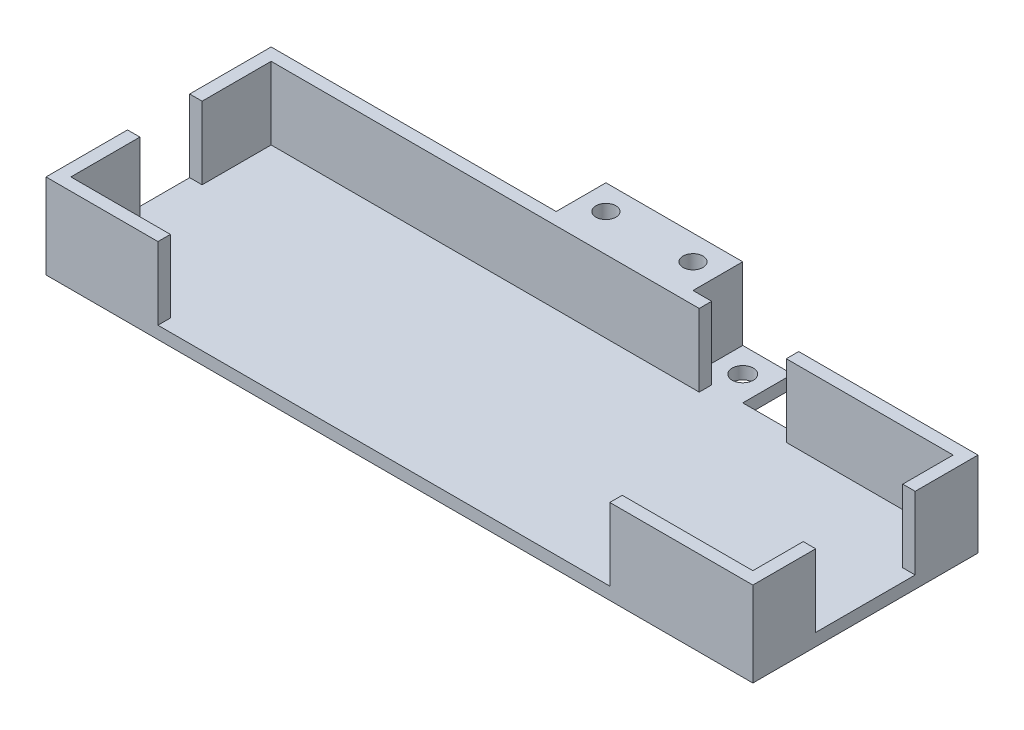
ISO-10303-21;
HEADER;
FILE_DESCRIPTION(('STEP AP214'),'2;1');
FILE_NAME('part.step','',(''),(''),'','','');
FILE_SCHEMA(('AUTOMOTIVE_DESIGN { 1 0 10303 214 1 1 1 1 }'));
ENDSEC;
DATA;
#1=APPLICATION_CONTEXT('core data for automotive mechanical design processes');
#2=APPLICATION_PROTOCOL_DEFINITION('international standard','automotive_design',2000,#1);
#3=PRODUCT_CONTEXT('',#1,'mechanical');
#4=PRODUCT('Part','Part','',(#3));
#5=PRODUCT_RELATED_PRODUCT_CATEGORY('part','',(#4));
#6=PRODUCT_DEFINITION_FORMATION('','',#4);
#7=PRODUCT_DEFINITION_CONTEXT('part definition',#1,'design');
#8=PRODUCT_DEFINITION('design','',#6,#7);
#9=PRODUCT_DEFINITION_SHAPE('','',#8);
#10=(LENGTH_UNIT() NAMED_UNIT(*) SI_UNIT(.MILLI.,.METRE.));
#11=(NAMED_UNIT(*) PLANE_ANGLE_UNIT() SI_UNIT($,.RADIAN.));
#12=(NAMED_UNIT(*) SI_UNIT($,.STERADIAN.) SOLID_ANGLE_UNIT());
#13=UNCERTAINTY_MEASURE_WITH_UNIT(LENGTH_MEASURE(1.E-05),#10,'distance_accuracy_value','');
#14=(GEOMETRIC_REPRESENTATION_CONTEXT(3) GLOBAL_UNCERTAINTY_ASSIGNED_CONTEXT((#13)) GLOBAL_UNIT_ASSIGNED_CONTEXT((#10,
#11,#12)) REPRESENTATION_CONTEXT('',''));
#15=CARTESIAN_POINT('',(0.,0.,0.));
#16=DIRECTION('',(0.,0.,1.));
#17=DIRECTION('',(1.,0.,0.));
#18=AXIS2_PLACEMENT_3D('',#15,#16,#17);
#19=CARTESIAN_POINT('',(0.,2.,-33.2));
#20=DIRECTION('',(0.,0.,-1.));
#21=DIRECTION('',(-1.,0.,0.));
#22=AXIS2_PLACEMENT_3D('',#19,#20,#21);
#23=PLANE('',#22);
#24=DIRECTION('',(0.,1.,0.));
#25=VECTOR('',#24,1.);
#26=CARTESIAN_POINT('',(67.825,-12.1421356237309,-33.2));
#27=LINE('',#26,#25);
#28=CARTESIAN_POINT('',(67.825,2.,-33.2));
#29=VERTEX_POINT('',#28);
#30=CARTESIAN_POINT('',(67.825,13.65,-33.2));
#31=VERTEX_POINT('',#30);
#32=EDGE_CURVE('E249',#29,#31,#27,.T.);
#33=ORIENTED_EDGE('',*,*,#32,.F.);
#34=DIRECTION('',(-1.,0.,0.));
#35=VECTOR('',#34,1.);
#36=CARTESIAN_POINT('',(34.825,2.,-33.2));
#37=LINE('',#36,#35);
#38=CARTESIAN_POINT('',(64.825,2.,-33.2));
#39=VERTEX_POINT('',#38);
#40=EDGE_CURVE('E454',#29,#39,#37,.T.);
#41=ORIENTED_EDGE('',*,*,#40,.T.);
#42=DIRECTION('',(0.,-1.,0.));
#43=VECTOR('',#42,1.);
#44=CARTESIAN_POINT('',(64.825,13.65,-33.2));
#45=LINE('',#44,#43);
#46=CARTESIAN_POINT('',(64.825,13.65,-33.2));
#47=VERTEX_POINT('',#46);
#48=EDGE_CURVE('E273',#47,#39,#45,.T.);
#49=ORIENTED_EDGE('',*,*,#48,.F.);
#50=DIRECTION('',(-1.,0.,0.));
#51=VECTOR('',#50,1.);
#52=CARTESIAN_POINT('',(110.65,13.65,-33.2));
#53=LINE('',#52,#51);
#54=EDGE_CURVE('E266',#31,#47,#53,.T.);
#55=ORIENTED_EDGE('',*,*,#54,.F.);
#56=EDGE_LOOP('',(#33,#41,#49,#55));
#57=FACE_BOUND('',#56,.T.);
#58=ADVANCED_FACE('F39',(#57),#23,.T.);
#59=CARTESIAN_POINT('',(108.65,13.65,-31.2));
#60=DIRECTION('',(0.,0.,-1.));
#61=DIRECTION('',(-1.,0.,0.));
#62=AXIS2_PLACEMENT_3D('',#59,#60,#61);
#63=PLANE('',#62);
#64=DIRECTION('',(1.,0.,0.));
#65=VECTOR('',#64,1.);
#66=CARTESIAN_POINT('',(108.65,13.65,-31.2));
#67=LINE('',#66,#65);
#68=CARTESIAN_POINT('',(81.825,13.65,-31.2));
#69=VERTEX_POINT('',#68);
#70=CARTESIAN_POINT('',(108.65,13.65,-31.2));
#71=VERTEX_POINT('',#70);
#72=EDGE_CURVE('E290',#69,#71,#67,.T.);
#73=ORIENTED_EDGE('',*,*,#72,.F.);
#74=DIRECTION('',(0.,1.,0.));
#75=VECTOR('',#74,1.);
#76=CARTESIAN_POINT('',(81.825,-12.1421356237309,-31.2));
#77=LINE('',#76,#75);
#78=CARTESIAN_POINT('',(81.825,2.,-31.2));
#79=VERTEX_POINT('',#78);
#80=EDGE_CURVE('E559',#79,#69,#77,.T.);
#81=ORIENTED_EDGE('',*,*,#80,.F.);
#82=DIRECTION('',(1.,0.,0.));
#83=VECTOR('',#82,1.);
#84=CARTESIAN_POINT('',(108.65,2.,-31.2));
#85=LINE('',#84,#83);
#86=CARTESIAN_POINT('',(108.65,2.,-31.2));
#87=VERTEX_POINT('',#86);
#88=EDGE_CURVE('E543',#79,#87,#85,.T.);
#89=ORIENTED_EDGE('',*,*,#88,.T.);
#90=DIRECTION('',(0.,-1.,0.));
#91=VECTOR('',#90,1.);
#92=CARTESIAN_POINT('',(108.65,13.65,-31.2));
#93=LINE('',#92,#91);
#94=EDGE_CURVE('E531',#71,#87,#93,.T.);
#95=ORIENTED_EDGE('',*,*,#94,.F.);
#96=EDGE_LOOP('',(#73,#81,#89,#95));
#97=FACE_BOUND('',#96,.T.);
#98=ADVANCED_FACE('F395',(#97),#63,.F.);
#99=CARTESIAN_POINT('',(0.,13.65,0.));
#100=DIRECTION('',(0.,-1.,0.));
#101=DIRECTION('',(0.,0.,-1.));
#102=AXIS2_PLACEMENT_3D('',#99,#100,#101);
#103=PLANE('',#102);
#104=CARTESIAN_POINT('',(110.65,13.65,-33.2));
#105=VERTEX_POINT('',#104);
#106=CARTESIAN_POINT('',(81.825,13.65,-33.2));
#107=VERTEX_POINT('',#106);
#108=EDGE_CURVE('E274',#105,#107,#53,.T.);
#109=ORIENTED_EDGE('',*,*,#108,.T.);
#110=DIRECTION('',(0.,0.,-1.));
#111=VECTOR('',#110,1.);
#112=CARTESIAN_POINT('',(81.825,13.65,-33.2));
#113=LINE('',#112,#111);
#114=EDGE_CURVE('E260',#69,#107,#113,.T.);
#115=ORIENTED_EDGE('',*,*,#114,.F.);
#116=ORIENTED_EDGE('',*,*,#72,.T.);
#117=DIRECTION('',(0.,0.,1.));
#118=VECTOR('',#117,1.);
#119=CARTESIAN_POINT('',(108.65,13.65,-23.1));
#120=LINE('',#119,#118);
#121=CARTESIAN_POINT('',(108.65,13.65,-23.1));
#122=VERTEX_POINT('',#121);
#123=EDGE_CURVE('E288',#71,#122,#120,.T.);
#124=ORIENTED_EDGE('',*,*,#123,.T.);
#125=DIRECTION('',(1.,0.,0.));
#126=VECTOR('',#125,1.);
#127=CARTESIAN_POINT('',(108.65,13.65,-23.1));
#128=LINE('',#127,#126);
#129=CARTESIAN_POINT('',(110.65,13.65,-23.1));
#130=VERTEX_POINT('',#129);
#131=EDGE_CURVE('E286',#122,#130,#128,.T.);
#132=ORIENTED_EDGE('',*,*,#131,.T.);
#133=DIRECTION('',(0.,0.,-1.));
#134=VECTOR('',#133,1.);
#135=CARTESIAN_POINT('',(110.65,13.65,-23.1));
#136=LINE('',#135,#134);
#137=EDGE_CURVE('E278',#130,#105,#136,.T.);
#138=ORIENTED_EDGE('',*,*,#137,.T.);
#139=EDGE_LOOP('',(#109,#115,#116,#124,#132,#138));
#140=FACE_BOUND('',#139,.T.);
#141=ADVANCED_FACE('F402',(#140),#103,.F.);
#142=CARTESIAN_POINT('',(42.825,13.65,-33.2));
#143=VERTEX_POINT('',#142);
#144=CARTESIAN_POINT('',(-3.,13.65,-33.2));
#145=VERTEX_POINT('',#144);
#146=EDGE_CURVE('E275',#143,#145,#53,.T.);
#147=ORIENTED_EDGE('',*,*,#146,.F.);
#148=DIRECTION('',(0.,-1.,0.));
#149=VECTOR('',#148,1.);
#150=CARTESIAN_POINT('',(42.825,13.65,-33.2));
#151=LINE('',#150,#149);
#152=CARTESIAN_POINT('',(42.825,2.,-33.2));
#153=VERTEX_POINT('',#152);
#154=EDGE_CURVE('E422',#143,#153,#151,.T.);
#155=ORIENTED_EDGE('',*,*,#154,.T.);
#156=CARTESIAN_POINT('',(34.825,2.,-33.2));
#157=VERTEX_POINT('',#156);
#158=EDGE_CURVE('E457',#153,#157,#37,.T.);
#159=ORIENTED_EDGE('',*,*,#158,.T.);
#160=DIRECTION('',(0.,-1.,0.));
#161=VECTOR('',#160,1.);
#162=CARTESIAN_POINT('',(34.825,2.,-33.2));
#163=LINE('',#162,#161);
#164=CARTESIAN_POINT('',(34.825,0.,-33.2));
#165=VERTEX_POINT('',#164);
#166=EDGE_CURVE('E467',#157,#165,#163,.T.);
#167=ORIENTED_EDGE('',*,*,#166,.T.);
#168=DIRECTION('',(1.,0.,0.));
#169=VECTOR('',#168,1.);
#170=CARTESIAN_POINT('',(0.,0.,-33.2));
#171=LINE('',#170,#169);
#172=CARTESIAN_POINT('',(-3.,0.,-33.2));
#173=VERTEX_POINT('',#172);
#174=EDGE_CURVE('E346',#173,#165,#171,.T.);
#175=ORIENTED_EDGE('',*,*,#174,.F.);
#176=DIRECTION('',(0.,-1.,0.));
#177=VECTOR('',#176,1.);
#178=CARTESIAN_POINT('',(-3.,2.,-33.2));
#179=LINE('',#178,#177);
#180=EDGE_CURVE('E350',#145,#173,#179,.T.);
#181=ORIENTED_EDGE('',*,*,#180,.F.);
#182=EDGE_LOOP('',(#147,#155,#159,#167,#175,#181));
#183=FACE_BOUND('',#182,.T.);
#184=ADVANCED_FACE('F398',(#183),#23,.T.);
#185=DIRECTION('',(0.,1.,0.));
#186=VECTOR('',#185,1.);
#187=CARTESIAN_POINT('',(81.825,-12.1421356237309,-33.2));
#188=LINE('',#187,#186);
#189=CARTESIAN_POINT('',(81.825,2.,-33.2));
#190=VERTEX_POINT('',#189);
#191=EDGE_CURVE('E561',#190,#107,#188,.T.);
#192=ORIENTED_EDGE('',*,*,#191,.T.);
#193=ORIENTED_EDGE('',*,*,#108,.F.);
#194=DIRECTION('',(0.,-1.,0.));
#195=VECTOR('',#194,1.);
#196=CARTESIAN_POINT('',(110.65,2.,-33.2));
#197=LINE('',#196,#195);
#198=CARTESIAN_POINT('',(110.65,0.,-33.2));
#199=VERTEX_POINT('',#198);
#200=EDGE_CURVE('E362',#105,#199,#197,.T.);
#201=ORIENTED_EDGE('',*,*,#200,.T.);
#202=CARTESIAN_POINT('',(72.825,0.,-33.2));
#203=VERTEX_POINT('',#202);
#204=EDGE_CURVE('E358',#203,#199,#171,.T.);
#205=ORIENTED_EDGE('',*,*,#204,.F.);
#206=DIRECTION('',(0.,-1.,0.));
#207=VECTOR('',#206,1.);
#208=CARTESIAN_POINT('',(72.825,2.,-33.2));
#209=LINE('',#208,#207);
#210=CARTESIAN_POINT('',(72.825,2.,-33.2));
#211=VERTEX_POINT('',#210);
#212=EDGE_CURVE('E475',#211,#203,#209,.T.);
#213=ORIENTED_EDGE('',*,*,#212,.F.);
#214=DIRECTION('',(1.,0.,0.));
#215=VECTOR('',#214,1.);
#216=CARTESIAN_POINT('',(67.825,2.,-33.2));
#217=LINE('',#216,#215);
#218=EDGE_CURVE('E567',#211,#190,#217,.T.);
#219=ORIENTED_EDGE('',*,*,#218,.T.);
#220=EDGE_LOOP('',(#192,#193,#201,#205,#213,#219));
#221=FACE_BOUND('',#220,.T.);
#222=ADVANCED_FACE('F397',(#221),#23,.T.);
#223=CARTESIAN_POINT('',(0.,2.,0.));
#224=DIRECTION('',(0.,1.,0.));
#225=DIRECTION('',(0.,0.,1.));
#226=AXIS2_PLACEMENT_3D('',#223,#224,#225);
#227=PLANE('',#226);
#228=CARTESIAN_POINT('',(38.825,2.,-37.2));
#229=DIRECTION('',(0.,-1.,0.));
#230=DIRECTION('',(0.,0.,1.));
#231=AXIS2_PLACEMENT_3D('',#228,#229,#230);
#232=CIRCLE('',#231,1.7);
#233=CARTESIAN_POINT('',(38.825,2.,-35.5));
#234=VERTEX_POINT('',#233);
#235=EDGE_CURVE('E441',#234,#234,#232,.T.);
#236=ORIENTED_EDGE('',*,*,#235,.T.);
#237=EDGE_LOOP('',(#236));
#238=FACE_BOUND('',#237,.T.);
#239=ORIENTED_EDGE('',*,*,#158,.F.);
#240=DIRECTION('',(0.,0.,1.));
#241=VECTOR('',#240,1.);
#242=CARTESIAN_POINT('',(42.825,2.,-33.2));
#243=LINE('',#242,#241);
#244=CARTESIAN_POINT('',(42.825,2.,-41.2));
#245=VERTEX_POINT('',#244);
#246=EDGE_CURVE('E437',#245,#153,#243,.T.);
#247=ORIENTED_EDGE('',*,*,#246,.F.);
#248=DIRECTION('',(1.,0.,0.));
#249=VECTOR('',#248,1.);
#250=CARTESIAN_POINT('',(34.825,2.,-41.2));
#251=LINE('',#250,#249);
#252=CARTESIAN_POINT('',(34.825,2.,-41.2));
#253=VERTEX_POINT('',#252);
#254=EDGE_CURVE('E461',#253,#245,#251,.T.);
#255=ORIENTED_EDGE('',*,*,#254,.F.);
#256=DIRECTION('',(0.,0.,-1.));
#257=VECTOR('',#256,1.);
#258=CARTESIAN_POINT('',(34.825,2.,-33.2));
#259=LINE('',#258,#257);
#260=EDGE_CURVE('E456',#157,#253,#259,.T.);
#261=ORIENTED_EDGE('',*,*,#260,.F.);
#262=EDGE_LOOP('',(#239,#247,#255,#261));
#263=FACE_BOUND('',#262,.T.);
#264=ADVANCED_FACE('F385',(#238,#263),#227,.T.);
#265=DIRECTION('',(1.,0.,0.));
#266=VECTOR('',#265,1.);
#267=CARTESIAN_POINT('',(0.,2.,3.));
#268=LINE('',#267,#266);
#269=CARTESIAN_POINT('',(15.,2.,3.));
#270=VERTEX_POINT('',#269);
#271=CARTESIAN_POINT('',(87.65,2.,3.));
#272=VERTEX_POINT('',#271);
#273=EDGE_CURVE('E345',#270,#272,#268,.T.);
#274=ORIENTED_EDGE('',*,*,#273,.T.);
#275=DIRECTION('',(0.,0.,1.));
#276=VECTOR('',#275,1.);
#277=CARTESIAN_POINT('',(87.65,2.,0.999999999999995));
#278=LINE('',#277,#276);
#279=CARTESIAN_POINT('',(87.65,2.,0.999999999999995));
#280=VERTEX_POINT('',#279);
#281=EDGE_CURVE('E505',#280,#272,#278,.T.);
#282=ORIENTED_EDGE('',*,*,#281,.F.);
#283=DIRECTION('',(-1.,0.,0.));
#284=VECTOR('',#283,1.);
#285=CARTESIAN_POINT('',(87.65,2.,0.999999999999995));
#286=LINE('',#285,#284);
#287=CARTESIAN_POINT('',(108.65,2.,1.));
#288=VERTEX_POINT('',#287);
#289=EDGE_CURVE('E508',#288,#280,#286,.T.);
#290=ORIENTED_EDGE('',*,*,#289,.F.);
#291=DIRECTION('',(0.,0.,1.));
#292=VECTOR('',#291,1.);
#293=CARTESIAN_POINT('',(108.65,2.,1.));
#294=LINE('',#293,#292);
#295=CARTESIAN_POINT('',(108.65,2.,-7.10000000000001));
#296=VERTEX_POINT('',#295);
#297=EDGE_CURVE('E498',#296,#288,#294,.T.);
#298=ORIENTED_EDGE('',*,*,#297,.F.);
#299=DIRECTION('',(-1.,0.,0.));
#300=VECTOR('',#299,1.);
#301=CARTESIAN_POINT('',(108.65,2.,-7.10000000000001));
#302=LINE('',#301,#300);
#303=CARTESIAN_POINT('',(110.65,2.,-7.1));
#304=VERTEX_POINT('',#303);
#305=EDGE_CURVE('E501',#304,#296,#302,.T.);
#306=ORIENTED_EDGE('',*,*,#305,.F.);
#307=DIRECTION('',(0.,0.,-1.));
#308=VECTOR('',#307,1.);
#309=CARTESIAN_POINT('',(110.65,2.,0.));
#310=LINE('',#309,#308);
#311=CARTESIAN_POINT('',(110.65,2.,-23.1));
#312=VERTEX_POINT('',#311);
#313=EDGE_CURVE('E348',#304,#312,#310,.T.);
#314=ORIENTED_EDGE('',*,*,#313,.T.);
#315=DIRECTION('',(1.,0.,0.));
#316=VECTOR('',#315,1.);
#317=CARTESIAN_POINT('',(108.65,2.,-23.1));
#318=LINE('',#317,#316);
#319=CARTESIAN_POINT('',(108.65,2.,-23.1));
#320=VERTEX_POINT('',#319);
#321=EDGE_CURVE('E299',#320,#312,#318,.T.);
#322=ORIENTED_EDGE('',*,*,#321,.F.);
#323=DIRECTION('',(0.,0.,1.));
#324=VECTOR('',#323,1.);
#325=CARTESIAN_POINT('',(108.65,2.,-23.1));
#326=LINE('',#325,#324);
#327=EDGE_CURVE('E541',#87,#320,#326,.T.);
#328=ORIENTED_EDGE('',*,*,#327,.F.);
#329=ORIENTED_EDGE('',*,*,#88,.F.);
#330=DIRECTION('',(0.,0.,1.));
#331=VECTOR('',#330,1.);
#332=CARTESIAN_POINT('',(81.825,2.,-33.2));
#333=LINE('',#332,#331);
#334=EDGE_CURVE('E650',#190,#79,#333,.T.);
#335=ORIENTED_EDGE('',*,*,#334,.F.);
#336=ORIENTED_EDGE('',*,*,#218,.F.);
#337=DIRECTION('',(0.,0.,1.));
#338=VECTOR('',#337,1.);
#339=CARTESIAN_POINT('',(72.825,2.,-33.2));
#340=LINE('',#339,#338);
#341=CARTESIAN_POINT('',(72.825,2.,-41.2));
#342=VERTEX_POINT('',#341);
#343=EDGE_CURVE('E464',#342,#211,#340,.T.);
#344=ORIENTED_EDGE('',*,*,#343,.F.);
#345=CARTESIAN_POINT('',(64.825,2.,-41.2));
#346=VERTEX_POINT('',#345);
#347=EDGE_CURVE('E460',#346,#342,#251,.T.);
#348=ORIENTED_EDGE('',*,*,#347,.F.);
#349=DIRECTION('',(0.,0.,-1.));
#350=VECTOR('',#349,1.);
#351=CARTESIAN_POINT('',(64.825,2.,-33.2));
#352=LINE('',#351,#350);
#353=EDGE_CURVE('E433',#39,#346,#352,.T.);
#354=ORIENTED_EDGE('',*,*,#353,.F.);
#355=ORIENTED_EDGE('',*,*,#40,.F.);
#356=DIRECTION('',(0.,0.,-1.));
#357=VECTOR('',#356,1.);
#358=CARTESIAN_POINT('',(67.825,2.,-33.2));
#359=LINE('',#358,#357);
#360=CARTESIAN_POINT('',(67.825,2.,-31.2));
#361=VERTEX_POINT('',#360);
#362=EDGE_CURVE('E255',#361,#29,#359,.T.);
#363=ORIENTED_EDGE('',*,*,#362,.F.);
#364=CARTESIAN_POINT('',(-1.,2.,-31.2));
#365=VERTEX_POINT('',#364);
#366=EDGE_CURVE('E544',#365,#361,#85,.T.);
#367=ORIENTED_EDGE('',*,*,#366,.F.);
#368=DIRECTION('',(0.,0.,-1.));
#369=VECTOR('',#368,1.);
#370=CARTESIAN_POINT('',(-1.,2.,-31.2));
#371=LINE('',#370,#369);
#372=CARTESIAN_POINT('',(-1.,2.,-20.1));
#373=VERTEX_POINT('',#372);
#374=EDGE_CURVE('E546',#373,#365,#371,.T.);
#375=ORIENTED_EDGE('',*,*,#374,.F.);
#376=DIRECTION('',(1.,0.,0.));
#377=VECTOR('',#376,1.);
#378=CARTESIAN_POINT('',(-1.,2.,-20.1));
#379=LINE('',#378,#377);
#380=CARTESIAN_POINT('',(-3.,2.,-20.1));
#381=VERTEX_POINT('',#380);
#382=EDGE_CURVE('E282',#381,#373,#379,.T.);
#383=ORIENTED_EDGE('',*,*,#382,.F.);
#384=DIRECTION('',(0.,0.,-1.));
#385=VECTOR('',#384,1.);
#386=CARTESIAN_POINT('',(-3.,2.,0.));
#387=LINE('',#386,#385);
#388=CARTESIAN_POINT('',(-3.,2.,-10.1));
#389=VERTEX_POINT('',#388);
#390=EDGE_CURVE('E342',#389,#381,#387,.T.);
#391=ORIENTED_EDGE('',*,*,#390,.F.);
#392=DIRECTION('',(-1.,0.,0.));
#393=VECTOR('',#392,1.);
#394=CARTESIAN_POINT('',(-0.999999999999999,2.,-10.1));
#395=LINE('',#394,#393);
#396=CARTESIAN_POINT('',(-0.999999999999999,2.,-10.1));
#397=VERTEX_POINT('',#396);
#398=EDGE_CURVE('E322',#397,#389,#395,.T.);
#399=ORIENTED_EDGE('',*,*,#398,.F.);
#400=DIRECTION('',(0.,0.,-1.));
#401=VECTOR('',#400,1.);
#402=CARTESIAN_POINT('',(-0.999999999999999,2.,-10.1));
#403=LINE('',#402,#401);
#404=CARTESIAN_POINT('',(-1.,2.,1.));
#405=VERTEX_POINT('',#404);
#406=EDGE_CURVE('E319',#405,#397,#403,.T.);
#407=ORIENTED_EDGE('',*,*,#406,.F.);
#408=DIRECTION('',(-1.,0.,0.));
#409=VECTOR('',#408,1.);
#410=CARTESIAN_POINT('',(-1.,2.,1.));
#411=LINE('',#410,#409);
#412=CARTESIAN_POINT('',(15.,2.,0.999999999999999));
#413=VERTEX_POINT('',#412);
#414=EDGE_CURVE('E316',#413,#405,#411,.T.);
#415=ORIENTED_EDGE('',*,*,#414,.F.);
#416=DIRECTION('',(0.,0.,-1.));
#417=VECTOR('',#416,1.);
#418=CARTESIAN_POINT('',(15.,2.,0.999999999999999));
#419=LINE('',#418,#417);
#420=EDGE_CURVE('E304',#270,#413,#419,.T.);
#421=ORIENTED_EDGE('',*,*,#420,.F.);
#422=EDGE_LOOP('',(#274,#282,#290,#298,#306,#314,#322,#328,#329,#335,#336,#344,#348,#354,#355,
#363,#367,#375,#383,#391,#399,#407,#415,#421));
#423=FACE_BOUND('',#422,.T.);
#424=CARTESIAN_POINT('',(68.825,2.,-37.2));
#425=DIRECTION('',(0.,-1.,0.));
#426=DIRECTION('',(0.,0.,1.));
#427=AXIS2_PLACEMENT_3D('',#424,#425,#426);
#428=CIRCLE('',#427,1.7);
#429=CARTESIAN_POINT('',(68.825,2.,-35.5));
#430=VERTEX_POINT('',#429);
#431=EDGE_CURVE('E449',#430,#430,#428,.T.);
#432=ORIENTED_EDGE('',*,*,#431,.T.);
#433=EDGE_LOOP('',(#432));
#434=FACE_BOUND('',#433,.T.);
#435=ADVANCED_FACE('F378',(#423,#434),#227,.T.);
#436=CARTESIAN_POINT('',(-3.,2.,0.));
#437=DIRECTION('',(-1.,0.,0.));
#438=DIRECTION('',(0.,0.,1.));
#439=AXIS2_PLACEMENT_3D('',#436,#437,#438);
#440=PLANE('',#439);
#441=DIRECTION('',(0.,0.,-1.));
#442=VECTOR('',#441,1.);
#443=CARTESIAN_POINT('',(-3.,0.,0.));
#444=LINE('',#443,#442);
#445=CARTESIAN_POINT('',(-3.,0.,3.));
#446=VERTEX_POINT('',#445);
#447=EDGE_CURVE('E341',#446,#173,#444,.T.);
#448=ORIENTED_EDGE('',*,*,#447,.F.);
#449=DIRECTION('',(0.,-1.,0.));
#450=VECTOR('',#449,1.);
#451=CARTESIAN_POINT('',(-3.,2.,3.));
#452=LINE('',#451,#450);
#453=CARTESIAN_POINT('',(-3.,13.65,3.));
#454=VERTEX_POINT('',#453);
#455=EDGE_CURVE('E368',#454,#446,#452,.T.);
#456=ORIENTED_EDGE('',*,*,#455,.F.);
#457=DIRECTION('',(0.,0.,1.));
#458=VECTOR('',#457,1.);
#459=CARTESIAN_POINT('',(-3.,13.65,-10.1));
#460=LINE('',#459,#458);
#461=CARTESIAN_POINT('',(-3.,13.65,-10.1));
#462=VERTEX_POINT('',#461);
#463=EDGE_CURVE('E308',#462,#454,#460,.T.);
#464=ORIENTED_EDGE('',*,*,#463,.F.);
#465=DIRECTION('',(0.,-1.,0.));
#466=VECTOR('',#465,1.);
#467=CARTESIAN_POINT('',(-3.,13.65,-10.1));
#468=LINE('',#467,#466);
#469=EDGE_CURVE('E332',#462,#389,#468,.T.);
#470=ORIENTED_EDGE('',*,*,#469,.T.);
#471=ORIENTED_EDGE('',*,*,#390,.T.);
#472=DIRECTION('',(0.,-1.,0.));
#473=VECTOR('',#472,1.);
#474=CARTESIAN_POINT('',(-3.,13.65,-20.1));
#475=LINE('',#474,#473);
#476=CARTESIAN_POINT('',(-3.,13.65,-20.1));
#477=VERTEX_POINT('',#476);
#478=EDGE_CURVE('E511',#477,#381,#475,.T.);
#479=ORIENTED_EDGE('',*,*,#478,.F.);
#480=DIRECTION('',(0.,0.,1.));
#481=VECTOR('',#480,1.);
#482=CARTESIAN_POINT('',(-3.,13.65,-33.2));
#483=LINE('',#482,#481);
#484=EDGE_CURVE('E296',#145,#477,#483,.T.);
#485=ORIENTED_EDGE('',*,*,#484,.F.);
#486=ORIENTED_EDGE('',*,*,#180,.T.);
#487=EDGE_LOOP('',(#448,#456,#464,#470,#471,#479,#485,#486));
#488=FACE_BOUND('',#487,.T.);
#489=ADVANCED_FACE('F41',(#488),#440,.T.);
#490=CARTESIAN_POINT('',(0.,2.,3.));
#491=DIRECTION('',(0.,0.,-1.));
#492=DIRECTION('',(-1.,0.,0.));
#493=AXIS2_PLACEMENT_3D('',#490,#491,#492);
#494=PLANE('',#493);
#495=DIRECTION('',(1.,0.,0.));
#496=VECTOR('',#495,1.);
#497=CARTESIAN_POINT('',(0.,0.,3.));
#498=LINE('',#497,#496);
#499=CARTESIAN_POINT('',(110.65,0.,3.));
#500=VERTEX_POINT('',#499);
#501=EDGE_CURVE('E353',#446,#500,#498,.T.);
#502=ORIENTED_EDGE('',*,*,#501,.T.);
#503=DIRECTION('',(0.,-1.,0.));
#504=VECTOR('',#503,1.);
#505=CARTESIAN_POINT('',(110.65,2.,3.));
#506=LINE('',#505,#504);
#507=CARTESIAN_POINT('',(110.65,13.65,3.));
#508=VERTEX_POINT('',#507);
#509=EDGE_CURVE('E365',#508,#500,#506,.T.);
#510=ORIENTED_EDGE('',*,*,#509,.F.);
#511=DIRECTION('',(1.,0.,0.));
#512=VECTOR('',#511,1.);
#513=CARTESIAN_POINT('',(87.65,13.65,2.99999999999999));
#514=LINE('',#513,#512);
#515=CARTESIAN_POINT('',(87.65,13.65,2.99999999999999));
#516=VERTEX_POINT('',#515);
#517=EDGE_CURVE('E517',#516,#508,#514,.T.);
#518=ORIENTED_EDGE('',*,*,#517,.F.);
#519=DIRECTION('',(0.,-1.,0.));
#520=VECTOR('',#519,1.);
#521=CARTESIAN_POINT('',(87.65,13.65,2.99999999999999));
#522=LINE('',#521,#520);
#523=EDGE_CURVE('E485',#516,#272,#522,.T.);
#524=ORIENTED_EDGE('',*,*,#523,.T.);
#525=ORIENTED_EDGE('',*,*,#273,.F.);
#526=DIRECTION('',(0.,-1.,0.));
#527=VECTOR('',#526,1.);
#528=CARTESIAN_POINT('',(15.,13.65,3.));
#529=LINE('',#528,#527);
#530=CARTESIAN_POINT('',(15.,13.65,3.));
#531=VERTEX_POINT('',#530);
#532=EDGE_CURVE('E329',#531,#270,#529,.T.);
#533=ORIENTED_EDGE('',*,*,#532,.F.);
#534=DIRECTION('',(1.,0.,0.));
#535=VECTOR('',#534,1.);
#536=CARTESIAN_POINT('',(-3.,13.65,3.));
#537=LINE('',#536,#535);
#538=EDGE_CURVE('E311',#454,#531,#537,.T.);
#539=ORIENTED_EDGE('',*,*,#538,.F.);
#540=ORIENTED_EDGE('',*,*,#455,.T.);
#541=EDGE_LOOP('',(#502,#510,#518,#524,#525,#533,#539,#540));
#542=FACE_BOUND('',#541,.T.);
#543=ADVANCED_FACE('F613',(#542),#494,.F.);
#544=CARTESIAN_POINT('',(110.65,2.,0.));
#545=DIRECTION('',(-1.,0.,0.));
#546=DIRECTION('',(0.,0.,1.));
#547=AXIS2_PLACEMENT_3D('',#544,#545,#546);
#548=PLANE('',#547);
#549=DIRECTION('',(0.,0.,-1.));
#550=VECTOR('',#549,1.);
#551=CARTESIAN_POINT('',(110.65,0.,0.));
#552=LINE('',#551,#550);
#553=EDGE_CURVE('E355',#500,#199,#552,.T.);
#554=ORIENTED_EDGE('',*,*,#553,.T.);
#555=ORIENTED_EDGE('',*,*,#200,.F.);
#556=ORIENTED_EDGE('',*,*,#137,.F.);
#557=DIRECTION('',(0.,-1.,0.));
#558=VECTOR('',#557,1.);
#559=CARTESIAN_POINT('',(110.65,13.65,-23.1));
#560=LINE('',#559,#558);
#561=EDGE_CURVE('E279',#130,#312,#560,.T.);
#562=ORIENTED_EDGE('',*,*,#561,.T.);
#563=ORIENTED_EDGE('',*,*,#313,.F.);
#564=DIRECTION('',(0.,-1.,0.));
#565=VECTOR('',#564,1.);
#566=CARTESIAN_POINT('',(110.65,13.65,-7.1));
#567=LINE('',#566,#565);
#568=CARTESIAN_POINT('',(110.65,13.65,-7.1));
#569=VERTEX_POINT('',#568);
#570=EDGE_CURVE('E488',#569,#304,#567,.T.);
#571=ORIENTED_EDGE('',*,*,#570,.F.);
#572=DIRECTION('',(0.,0.,-1.));
#573=VECTOR('',#572,1.);
#574=CARTESIAN_POINT('',(110.65,13.65,3.));
#575=LINE('',#574,#573);
#576=EDGE_CURVE('E515',#508,#569,#575,.T.);
#577=ORIENTED_EDGE('',*,*,#576,.F.);
#578=ORIENTED_EDGE('',*,*,#509,.T.);
#579=EDGE_LOOP('',(#554,#555,#556,#562,#563,#571,#577,#578));
#580=FACE_BOUND('',#579,.T.);
#581=ADVANCED_FACE('F641',(#580),#548,.F.);
#582=CARTESIAN_POINT('',(0.,0.,0.));
#583=DIRECTION('',(0.,1.,0.));
#584=DIRECTION('',(0.,0.,1.));
#585=AXIS2_PLACEMENT_3D('',#582,#583,#584);
#586=PLANE('',#585);
#587=ORIENTED_EDGE('',*,*,#447,.T.);
#588=ORIENTED_EDGE('',*,*,#174,.T.);
#589=DIRECTION('',(0.,0.,-1.));
#590=VECTOR('',#589,1.);
#591=CARTESIAN_POINT('',(34.825,0.,-33.2));
#592=LINE('',#591,#590);
#593=CARTESIAN_POINT('',(34.825,0.,-41.2));
#594=VERTEX_POINT('',#593);
#595=EDGE_CURVE('E62',#165,#594,#592,.T.);
#596=ORIENTED_EDGE('',*,*,#595,.T.);
#597=DIRECTION('',(1.,0.,0.));
#598=VECTOR('',#597,1.);
#599=CARTESIAN_POINT('',(34.825,0.,-41.2));
#600=LINE('',#599,#598);
#601=CARTESIAN_POINT('',(72.825,0.,-41.2));
#602=VERTEX_POINT('',#601);
#603=EDGE_CURVE('E469',#594,#602,#600,.T.);
#604=ORIENTED_EDGE('',*,*,#603,.T.);
#605=DIRECTION('',(0.,0.,1.));
#606=VECTOR('',#605,1.);
#607=CARTESIAN_POINT('',(72.825,0.,-33.2));
#608=LINE('',#607,#606);
#609=EDGE_CURVE('E472',#602,#203,#608,.T.);
#610=ORIENTED_EDGE('',*,*,#609,.T.);
#611=ORIENTED_EDGE('',*,*,#204,.T.);
#612=ORIENTED_EDGE('',*,*,#553,.F.);
#613=ORIENTED_EDGE('',*,*,#501,.F.);
#614=EDGE_LOOP('',(#587,#588,#596,#604,#610,#611,#612,#613));
#615=FACE_BOUND('',#614,.T.);
#616=CARTESIAN_POINT('',(38.825,0.,-37.2));
#617=DIRECTION('',(0.,-1.,0.));
#618=DIRECTION('',(0.,0.,1.));
#619=AXIS2_PLACEMENT_3D('',#616,#617,#618);
#620=CIRCLE('',#619,1.7);
#621=CARTESIAN_POINT('',(38.825,0.,-35.5));
#622=VERTEX_POINT('',#621);
#623=EDGE_CURVE('E438',#622,#622,#620,.T.);
#624=ORIENTED_EDGE('',*,*,#623,.F.);
#625=EDGE_LOOP('',(#624));
#626=FACE_BOUND('',#625,.T.);
#627=CARTESIAN_POINT('',(68.825,0.,-37.2));
#628=DIRECTION('',(0.,-1.,0.));
#629=DIRECTION('',(0.,0.,1.));
#630=AXIS2_PLACEMENT_3D('',#627,#628,#629);
#631=CIRCLE('',#630,1.7);
#632=CARTESIAN_POINT('',(68.825,0.,-35.5));
#633=VERTEX_POINT('',#632);
#634=EDGE_CURVE('E447',#633,#633,#631,.T.);
#635=ORIENTED_EDGE('',*,*,#634,.F.);
#636=EDGE_LOOP('',(#635));
#637=FACE_BOUND('',#636,.T.);
#638=ADVANCED_FACE('F585',(#615,#626,#637),#586,.F.);
#639=CARTESIAN_POINT('',(-1.,13.65,1.));
#640=DIRECTION('',(0.,0.,1.));
#641=DIRECTION('',(1.,0.,0.));
#642=AXIS2_PLACEMENT_3D('',#639,#640,#641);
#643=PLANE('',#642);
#644=ORIENTED_EDGE('',*,*,#414,.T.);
#645=DIRECTION('',(0.,-1.,0.));
#646=VECTOR('',#645,1.);
#647=CARTESIAN_POINT('',(-1.,13.65,1.));
#648=LINE('',#647,#646);
#649=CARTESIAN_POINT('',(-1.,13.65,1.));
#650=VERTEX_POINT('',#649);
#651=EDGE_CURVE('E338',#650,#405,#648,.T.);
#652=ORIENTED_EDGE('',*,*,#651,.F.);
#653=DIRECTION('',(-1.,0.,0.));
#654=VECTOR('',#653,1.);
#655=CARTESIAN_POINT('',(-1.,13.65,1.));
#656=LINE('',#655,#654);
#657=CARTESIAN_POINT('',(15.,13.65,0.999999999999999));
#658=VERTEX_POINT('',#657);
#659=EDGE_CURVE('E300',#658,#650,#656,.T.);
#660=ORIENTED_EDGE('',*,*,#659,.F.);
#661=DIRECTION('',(0.,-1.,0.));
#662=VECTOR('',#661,1.);
#663=CARTESIAN_POINT('',(15.,13.65,0.999999999999999));
#664=LINE('',#663,#662);
#665=EDGE_CURVE('E315',#658,#413,#664,.T.);
#666=ORIENTED_EDGE('',*,*,#665,.T.);
#667=EDGE_LOOP('',(#644,#652,#660,#666));
#668=FACE_BOUND('',#667,.T.);
#669=ADVANCED_FACE('F608',(#668),#643,.F.);
#670=CARTESIAN_POINT('',(-0.999999999999999,13.65,-10.1));
#671=DIRECTION('',(-1.,0.,0.));
#672=DIRECTION('',(0.,0.,1.));
#673=AXIS2_PLACEMENT_3D('',#670,#671,#672);
#674=PLANE('',#673);
#675=ORIENTED_EDGE('',*,*,#406,.T.);
#676=DIRECTION('',(0.,-1.,0.));
#677=VECTOR('',#676,1.);
#678=CARTESIAN_POINT('',(-0.999999999999999,13.65,-10.1));
#679=LINE('',#678,#677);
#680=CARTESIAN_POINT('',(-0.999999999999999,13.65,-10.1));
#681=VERTEX_POINT('',#680);
#682=EDGE_CURVE('E335',#681,#397,#679,.T.);
#683=ORIENTED_EDGE('',*,*,#682,.F.);
#684=DIRECTION('',(0.,0.,-1.));
#685=VECTOR('',#684,1.);
#686=CARTESIAN_POINT('',(-0.999999999999999,13.65,-10.1));
#687=LINE('',#686,#685);
#688=EDGE_CURVE('E303',#650,#681,#687,.T.);
#689=ORIENTED_EDGE('',*,*,#688,.F.);
#690=ORIENTED_EDGE('',*,*,#651,.T.);
#691=EDGE_LOOP('',(#675,#683,#689,#690));
#692=FACE_BOUND('',#691,.T.);
#693=ADVANCED_FACE('F598',(#692),#674,.F.);
#694=CARTESIAN_POINT('',(-0.999999999999999,13.65,-10.1));
#695=DIRECTION('',(0.,0.,1.));
#696=DIRECTION('',(1.,0.,0.));
#697=AXIS2_PLACEMENT_3D('',#694,#695,#696);
#698=PLANE('',#697);
#699=ORIENTED_EDGE('',*,*,#398,.T.);
#700=ORIENTED_EDGE('',*,*,#469,.F.);
#701=DIRECTION('',(-1.,0.,0.));
#702=VECTOR('',#701,1.);
#703=CARTESIAN_POINT('',(-0.999999999999999,13.65,-10.1));
#704=LINE('',#703,#702);
#705=EDGE_CURVE('E306',#681,#462,#704,.T.);
#706=ORIENTED_EDGE('',*,*,#705,.F.);
#707=ORIENTED_EDGE('',*,*,#682,.T.);
#708=EDGE_LOOP('',(#699,#700,#706,#707));
#709=FACE_BOUND('',#708,.T.);
#710=ADVANCED_FACE('F594',(#709),#698,.F.);
#711=CARTESIAN_POINT('',(15.,13.65,0.999999999999999));
#712=DIRECTION('',(-1.,0.,0.));
#713=DIRECTION('',(0.,0.,1.));
#714=AXIS2_PLACEMENT_3D('',#711,#712,#713);
#715=PLANE('',#714);
#716=ORIENTED_EDGE('',*,*,#420,.T.);
#717=ORIENTED_EDGE('',*,*,#665,.F.);
#718=DIRECTION('',(0.,0.,-1.));
#719=VECTOR('',#718,1.);
#720=CARTESIAN_POINT('',(15.,13.65,0.999999999999999));
#721=LINE('',#720,#719);
#722=EDGE_CURVE('E313',#531,#658,#721,.T.);
#723=ORIENTED_EDGE('',*,*,#722,.F.);
#724=ORIENTED_EDGE('',*,*,#532,.T.);
#725=EDGE_LOOP('',(#716,#717,#723,#724));
#726=FACE_BOUND('',#725,.T.);
#727=ADVANCED_FACE('F604',(#726),#715,.F.);
#728=CARTESIAN_POINT('',(0.,13.65,0.));
#729=DIRECTION('',(0.,-1.,0.));
#730=DIRECTION('',(0.,0.,-1.));
#731=AXIS2_PLACEMENT_3D('',#728,#729,#730);
#732=PLANE('',#731);
#733=ORIENTED_EDGE('',*,*,#659,.T.);
#734=ORIENTED_EDGE('',*,*,#688,.T.);
#735=ORIENTED_EDGE('',*,*,#705,.T.);
#736=ORIENTED_EDGE('',*,*,#463,.T.);
#737=ORIENTED_EDGE('',*,*,#538,.T.);
#738=ORIENTED_EDGE('',*,*,#722,.T.);
#739=EDGE_LOOP('',(#733,#734,#735,#736,#737,#738));
#740=FACE_BOUND('',#739,.T.);
#741=ADVANCED_FACE('F610',(#740),#732,.F.);
#742=CARTESIAN_POINT('',(-1.,13.65,-20.1));
#743=DIRECTION('',(0.,0.,-1.));
#744=DIRECTION('',(-1.,0.,0.));
#745=AXIS2_PLACEMENT_3D('',#742,#743,#744);
#746=PLANE('',#745);
#747=ORIENTED_EDGE('',*,*,#382,.T.);
#748=DIRECTION('',(0.,-1.,0.));
#749=VECTOR('',#748,1.);
#750=CARTESIAN_POINT('',(-1.,13.65,-20.1));
#751=LINE('',#750,#749);
#752=CARTESIAN_POINT('',(-1.,13.65,-20.1));
#753=VERTEX_POINT('',#752);
#754=EDGE_CURVE('E525',#753,#373,#751,.T.);
#755=ORIENTED_EDGE('',*,*,#754,.F.);
#756=DIRECTION('',(1.,0.,0.));
#757=VECTOR('',#756,1.);
#758=CARTESIAN_POINT('',(-1.,13.65,-20.1));
#759=LINE('',#758,#757);
#760=EDGE_CURVE('E294',#477,#753,#759,.T.);
#761=ORIENTED_EDGE('',*,*,#760,.F.);
#762=ORIENTED_EDGE('',*,*,#478,.T.);
#763=EDGE_LOOP('',(#747,#755,#761,#762));
#764=FACE_BOUND('',#763,.T.);
#765=ADVANCED_FACE('F553',(#764),#746,.F.);
#766=CARTESIAN_POINT('',(-1.,13.65,-31.2));
#767=DIRECTION('',(-1.,0.,0.));
#768=DIRECTION('',(0.,0.,1.));
#769=AXIS2_PLACEMENT_3D('',#766,#767,#768);
#770=PLANE('',#769);
#771=ORIENTED_EDGE('',*,*,#374,.T.);
#772=DIRECTION('',(0.,-1.,0.));
#773=VECTOR('',#772,1.);
#774=CARTESIAN_POINT('',(-1.,13.65,-31.2));
#775=LINE('',#774,#773);
#776=CARTESIAN_POINT('',(-1.,13.65,-31.2));
#777=VERTEX_POINT('',#776);
#778=EDGE_CURVE('E528',#777,#365,#775,.T.);
#779=ORIENTED_EDGE('',*,*,#778,.F.);
#780=DIRECTION('',(0.,0.,-1.));
#781=VECTOR('',#780,1.);
#782=CARTESIAN_POINT('',(-1.,13.65,-31.2));
#783=LINE('',#782,#781);
#784=EDGE_CURVE('E292',#753,#777,#783,.T.);
#785=ORIENTED_EDGE('',*,*,#784,.F.);
#786=ORIENTED_EDGE('',*,*,#754,.T.);
#787=EDGE_LOOP('',(#771,#779,#785,#786));
#788=FACE_BOUND('',#787,.T.);
#789=ADVANCED_FACE('F555',(#788),#770,.F.);
#790=ORIENTED_EDGE('',*,*,#366,.T.);
#791=DIRECTION('',(0.,1.,0.));
#792=VECTOR('',#791,1.);
#793=CARTESIAN_POINT('',(67.825,-12.1421356237309,-31.2));
#794=LINE('',#793,#792);
#795=CARTESIAN_POINT('',(67.825,13.65,-31.2));
#796=VERTEX_POINT('',#795);
#797=EDGE_CURVE('E259',#361,#796,#794,.T.);
#798=ORIENTED_EDGE('',*,*,#797,.T.);
#799=EDGE_CURVE('E269',#777,#796,#67,.T.);
#800=ORIENTED_EDGE('',*,*,#799,.F.);
#801=ORIENTED_EDGE('',*,*,#778,.T.);
#802=EDGE_LOOP('',(#790,#798,#800,#801));
#803=FACE_BOUND('',#802,.T.);
#804=ADVANCED_FACE('F405',(#803),#63,.F.);
#805=CARTESIAN_POINT('',(108.65,13.65,-23.1));
#806=DIRECTION('',(1.,0.,0.));
#807=DIRECTION('',(0.,0.,-1.));
#808=AXIS2_PLACEMENT_3D('',#805,#806,#807);
#809=PLANE('',#808);
#810=ORIENTED_EDGE('',*,*,#327,.T.);
#811=DIRECTION('',(0.,-1.,0.));
#812=VECTOR('',#811,1.);
#813=CARTESIAN_POINT('',(108.65,13.65,-23.1));
#814=LINE('',#813,#812);
#815=EDGE_CURVE('E534',#122,#320,#814,.T.);
#816=ORIENTED_EDGE('',*,*,#815,.F.);
#817=ORIENTED_EDGE('',*,*,#123,.F.);
#818=ORIENTED_EDGE('',*,*,#94,.T.);
#819=EDGE_LOOP('',(#810,#816,#817,#818));
#820=FACE_BOUND('',#819,.T.);
#821=ADVANCED_FACE('F660',(#820),#809,.F.);
#822=CARTESIAN_POINT('',(108.65,13.65,-23.1));
#823=DIRECTION('',(0.,0.,-1.));
#824=DIRECTION('',(-1.,0.,0.));
#825=AXIS2_PLACEMENT_3D('',#822,#823,#824);
#826=PLANE('',#825);
#827=ORIENTED_EDGE('',*,*,#321,.T.);
#828=ORIENTED_EDGE('',*,*,#561,.F.);
#829=ORIENTED_EDGE('',*,*,#131,.F.);
#830=ORIENTED_EDGE('',*,*,#815,.T.);
#831=EDGE_LOOP('',(#827,#828,#829,#830));
#832=FACE_BOUND('',#831,.T.);
#833=ADVANCED_FACE('F637',(#832),#826,.F.);
#834=ORIENTED_EDGE('',*,*,#799,.T.);
#835=DIRECTION('',(0.,0.,1.));
#836=VECTOR('',#835,1.);
#837=CARTESIAN_POINT('',(67.825,13.65,-33.2));
#838=LINE('',#837,#836);
#839=EDGE_CURVE('E252',#31,#796,#838,.T.);
#840=ORIENTED_EDGE('',*,*,#839,.F.);
#841=ORIENTED_EDGE('',*,*,#54,.T.);
#842=DIRECTION('',(0.,0.,-1.));
#843=VECTOR('',#842,1.);
#844=CARTESIAN_POINT('',(64.825,13.65,-33.2));
#845=LINE('',#844,#843);
#846=CARTESIAN_POINT('',(64.825,13.65,-41.2));
#847=VERTEX_POINT('',#846);
#848=EDGE_CURVE('E432',#47,#847,#845,.T.);
#849=ORIENTED_EDGE('',*,*,#848,.T.);
#850=DIRECTION('',(-1.,0.,0.));
#851=VECTOR('',#850,1.);
#852=CARTESIAN_POINT('',(42.825,13.65,-41.2));
#853=LINE('',#852,#851);
#854=CARTESIAN_POINT('',(42.825,13.65,-41.2));
#855=VERTEX_POINT('',#854);
#856=EDGE_CURVE('E429',#847,#855,#853,.T.);
#857=ORIENTED_EDGE('',*,*,#856,.T.);
#858=DIRECTION('',(0.,0.,1.));
#859=VECTOR('',#858,1.);
#860=CARTESIAN_POINT('',(42.825,13.65,-33.2));
#861=LINE('',#860,#859);
#862=EDGE_CURVE('E428',#855,#143,#861,.T.);
#863=ORIENTED_EDGE('',*,*,#862,.T.);
#864=ORIENTED_EDGE('',*,*,#146,.T.);
#865=ORIENTED_EDGE('',*,*,#484,.T.);
#866=ORIENTED_EDGE('',*,*,#760,.T.);
#867=ORIENTED_EDGE('',*,*,#784,.T.);
#868=EDGE_LOOP('',(#834,#840,#841,#849,#857,#863,#864,#865,#866,#867));
#869=FACE_BOUND('',#868,.T.);
#870=CARTESIAN_POINT('',(46.825,13.65,-37.2));
#871=DIRECTION('',(0.,1.,0.));
#872=DIRECTION('',(0.,0.,1.));
#873=AXIS2_PLACEMENT_3D('',#870,#871,#872);
#874=CIRCLE('',#873,1.6);
#875=CARTESIAN_POINT('',(46.825,13.65,-35.6));
#876=VERTEX_POINT('',#875);
#877=EDGE_CURVE('E570',#876,#876,#874,.T.);
#878=ORIENTED_EDGE('',*,*,#877,.F.);
#879=EDGE_LOOP('',(#878));
#880=FACE_BOUND('',#879,.T.);
#881=CARTESIAN_POINT('',(60.825,13.65,-37.2));
#882=DIRECTION('',(0.,1.,0.));
#883=DIRECTION('',(0.,0.,-1.));
#884=AXIS2_PLACEMENT_3D('',#881,#882,#883);
#885=CIRCLE('',#884,1.6);
#886=CARTESIAN_POINT('',(60.825,13.65,-38.8));
#887=VERTEX_POINT('',#886);
#888=EDGE_CURVE('E566',#887,#887,#885,.T.);
#889=ORIENTED_EDGE('',*,*,#888,.F.);
#890=EDGE_LOOP('',(#889));
#891=FACE_BOUND('',#890,.T.);
#892=ADVANCED_FACE('F264',(#869,#880,#891),#103,.F.);
#893=CARTESIAN_POINT('',(87.65,13.65,0.999999999999995));
#894=DIRECTION('',(0.,0.,1.));
#895=DIRECTION('',(1.,0.,0.));
#896=AXIS2_PLACEMENT_3D('',#893,#894,#895);
#897=PLANE('',#896);
#898=ORIENTED_EDGE('',*,*,#289,.T.);
#899=DIRECTION('',(0.,-1.,0.));
#900=VECTOR('',#899,1.);
#901=CARTESIAN_POINT('',(87.65,13.65,0.999999999999995));
#902=LINE('',#901,#900);
#903=CARTESIAN_POINT('',(87.65,13.65,0.999999999999995));
#904=VERTEX_POINT('',#903);
#905=EDGE_CURVE('E477',#904,#280,#902,.T.);
#906=ORIENTED_EDGE('',*,*,#905,.F.);
#907=DIRECTION('',(-1.,0.,0.));
#908=VECTOR('',#907,1.);
#909=CARTESIAN_POINT('',(87.65,13.65,0.999999999999995));
#910=LINE('',#909,#908);
#911=CARTESIAN_POINT('',(108.65,13.65,1.));
#912=VERTEX_POINT('',#911);
#913=EDGE_CURVE('E502',#912,#904,#910,.T.);
#914=ORIENTED_EDGE('',*,*,#913,.F.);
#915=DIRECTION('',(0.,-1.,0.));
#916=VECTOR('',#915,1.);
#917=CARTESIAN_POINT('',(108.65,13.65,1.));
#918=LINE('',#917,#916);
#919=EDGE_CURVE('E494',#912,#288,#918,.T.);
#920=ORIENTED_EDGE('',*,*,#919,.T.);
#921=EDGE_LOOP('',(#898,#906,#914,#920));
#922=FACE_BOUND('',#921,.T.);
#923=ADVANCED_FACE('F621',(#922),#897,.F.);
#924=CARTESIAN_POINT('',(87.65,13.65,0.999999999999995));
#925=DIRECTION('',(1.,0.,0.));
#926=DIRECTION('',(0.,0.,-1.));
#927=AXIS2_PLACEMENT_3D('',#924,#925,#926);
#928=PLANE('',#927);
#929=ORIENTED_EDGE('',*,*,#281,.T.);
#930=ORIENTED_EDGE('',*,*,#523,.F.);
#931=DIRECTION('',(0.,0.,1.));
#932=VECTOR('',#931,1.);
#933=CARTESIAN_POINT('',(87.65,13.65,0.999999999999995));
#934=LINE('',#933,#932);
#935=EDGE_CURVE('E520',#904,#516,#934,.T.);
#936=ORIENTED_EDGE('',*,*,#935,.F.);
#937=ORIENTED_EDGE('',*,*,#905,.T.);
#938=EDGE_LOOP('',(#929,#930,#936,#937));
#939=FACE_BOUND('',#938,.T.);
#940=ADVANCED_FACE('F617',(#939),#928,.F.);
#941=CARTESIAN_POINT('',(108.65,13.65,-7.10000000000001));
#942=DIRECTION('',(0.,0.,1.));
#943=DIRECTION('',(1.,0.,0.));
#944=AXIS2_PLACEMENT_3D('',#941,#942,#943);
#945=PLANE('',#944);
#946=ORIENTED_EDGE('',*,*,#305,.T.);
#947=DIRECTION('',(0.,-1.,0.));
#948=VECTOR('',#947,1.);
#949=CARTESIAN_POINT('',(108.65,13.65,-7.10000000000001));
#950=LINE('',#949,#948);
#951=CARTESIAN_POINT('',(108.65,13.65,-7.10000000000001));
#952=VERTEX_POINT('',#951);
#953=EDGE_CURVE('E491',#952,#296,#950,.T.);
#954=ORIENTED_EDGE('',*,*,#953,.F.);
#955=DIRECTION('',(-1.,0.,0.));
#956=VECTOR('',#955,1.);
#957=CARTESIAN_POINT('',(108.65,13.65,-7.10000000000001));
#958=LINE('',#957,#956);
#959=EDGE_CURVE('E513',#569,#952,#958,.T.);
#960=ORIENTED_EDGE('',*,*,#959,.F.);
#961=ORIENTED_EDGE('',*,*,#570,.T.);
#962=EDGE_LOOP('',(#946,#954,#960,#961));
#963=FACE_BOUND('',#962,.T.);
#964=ADVANCED_FACE('F630',(#963),#945,.F.);
#965=CARTESIAN_POINT('',(108.65,13.65,1.));
#966=DIRECTION('',(1.,0.,0.));
#967=DIRECTION('',(0.,0.,-1.));
#968=AXIS2_PLACEMENT_3D('',#965,#966,#967);
#969=PLANE('',#968);
#970=ORIENTED_EDGE('',*,*,#297,.T.);
#971=ORIENTED_EDGE('',*,*,#919,.F.);
#972=DIRECTION('',(0.,0.,1.));
#973=VECTOR('',#972,1.);
#974=CARTESIAN_POINT('',(108.65,13.65,1.));
#975=LINE('',#974,#973);
#976=EDGE_CURVE('E497',#952,#912,#975,.T.);
#977=ORIENTED_EDGE('',*,*,#976,.F.);
#978=ORIENTED_EDGE('',*,*,#953,.T.);
#979=EDGE_LOOP('',(#970,#971,#977,#978));
#980=FACE_BOUND('',#979,.T.);
#981=ADVANCED_FACE('F625',(#980),#969,.F.);
#982=CARTESIAN_POINT('',(0.,13.65,0.));
#983=DIRECTION('',(0.,1.,0.));
#984=DIRECTION('',(0.,0.,1.));
#985=AXIS2_PLACEMENT_3D('',#982,#983,#984);
#986=PLANE('',#985);
#987=ORIENTED_EDGE('',*,*,#913,.T.);
#988=ORIENTED_EDGE('',*,*,#935,.T.);
#989=ORIENTED_EDGE('',*,*,#517,.T.);
#990=ORIENTED_EDGE('',*,*,#576,.T.);
#991=ORIENTED_EDGE('',*,*,#959,.T.);
#992=ORIENTED_EDGE('',*,*,#976,.T.);
#993=EDGE_LOOP('',(#987,#988,#989,#990,#991,#992));
#994=FACE_BOUND('',#993,.T.);
#995=ADVANCED_FACE('F669',(#994),#986,.T.);
#996=CARTESIAN_POINT('',(72.825,2.,-33.2));
#997=DIRECTION('',(1.,0.,0.));
#998=DIRECTION('',(0.,0.,-1.));
#999=AXIS2_PLACEMENT_3D('',#996,#997,#998);
#1000=PLANE('',#999);
#1001=ORIENTED_EDGE('',*,*,#609,.F.);
#1002=DIRECTION('',(0.,-1.,0.));
#1003=VECTOR('',#1002,1.);
#1004=CARTESIAN_POINT('',(72.825,2.,-41.2));
#1005=LINE('',#1004,#1003);
#1006=EDGE_CURVE('E478',#342,#602,#1005,.T.);
#1007=ORIENTED_EDGE('',*,*,#1006,.F.);
#1008=ORIENTED_EDGE('',*,*,#343,.T.);
#1009=ORIENTED_EDGE('',*,*,#212,.T.);
#1010=EDGE_LOOP('',(#1001,#1007,#1008,#1009));
#1011=FACE_BOUND('',#1010,.T.);
#1012=ADVANCED_FACE('F666',(#1011),#1000,.T.);
#1013=CARTESIAN_POINT('',(34.825,2.,-41.2));
#1014=DIRECTION('',(0.,0.,-1.));
#1015=DIRECTION('',(-1.,0.,0.));
#1016=AXIS2_PLACEMENT_3D('',#1013,#1014,#1015);
#1017=PLANE('',#1016);
#1018=ORIENTED_EDGE('',*,*,#603,.F.);
#1019=DIRECTION('',(0.,-1.,0.));
#1020=VECTOR('',#1019,1.);
#1021=CARTESIAN_POINT('',(34.825,2.,-41.2));
#1022=LINE('',#1021,#1020);
#1023=EDGE_CURVE('E480',#253,#594,#1022,.T.);
#1024=ORIENTED_EDGE('',*,*,#1023,.F.);
#1025=ORIENTED_EDGE('',*,*,#254,.T.);
#1026=DIRECTION('',(0.,-1.,0.));
#1027=VECTOR('',#1026,1.);
#1028=CARTESIAN_POINT('',(42.825,13.65,-41.2));
#1029=LINE('',#1028,#1027);
#1030=EDGE_CURVE('E575',#855,#245,#1029,.T.);
#1031=ORIENTED_EDGE('',*,*,#1030,.F.);
#1032=ORIENTED_EDGE('',*,*,#856,.F.);
#1033=DIRECTION('',(0.,-1.,0.));
#1034=VECTOR('',#1033,1.);
#1035=CARTESIAN_POINT('',(64.825,13.65,-41.2));
#1036=LINE('',#1035,#1034);
#1037=EDGE_CURVE('E54',#847,#346,#1036,.T.);
#1038=ORIENTED_EDGE('',*,*,#1037,.T.);
#1039=ORIENTED_EDGE('',*,*,#347,.T.);
#1040=ORIENTED_EDGE('',*,*,#1006,.T.);
#1041=EDGE_LOOP('',(#1018,#1024,#1025,#1031,#1032,#1038,#1039,#1040));
#1042=FACE_BOUND('',#1041,.T.);
#1043=ADVANCED_FACE('F582',(#1042),#1017,.T.);
#1044=CARTESIAN_POINT('',(34.825,2.,-33.2));
#1045=DIRECTION('',(-1.,0.,0.));
#1046=DIRECTION('',(0.,0.,1.));
#1047=AXIS2_PLACEMENT_3D('',#1044,#1045,#1046);
#1048=PLANE('',#1047);
#1049=ORIENTED_EDGE('',*,*,#595,.F.);
#1050=ORIENTED_EDGE('',*,*,#166,.F.);
#1051=ORIENTED_EDGE('',*,*,#260,.T.);
#1052=ORIENTED_EDGE('',*,*,#1023,.T.);
#1053=EDGE_LOOP('',(#1049,#1050,#1051,#1052));
#1054=FACE_BOUND('',#1053,.T.);
#1055=ADVANCED_FACE('F583',(#1054),#1048,.T.);
#1056=CARTESIAN_POINT('',(68.825,2.,-37.2));
#1057=DIRECTION('',(0.,-1.,0.));
#1058=DIRECTION('',(0.,0.,-1.));
#1059=AXIS2_PLACEMENT_3D('',#1056,#1057,#1058);
#1060=CYLINDRICAL_SURFACE('',#1059,1.7);
#1061=ORIENTED_EDGE('',*,*,#431,.F.);
#1062=EDGE_LOOP('',(#1061));
#1063=FACE_BOUND('',#1062,.T.);
#1064=ORIENTED_EDGE('',*,*,#634,.T.);
#1065=EDGE_LOOP('',(#1064));
#1066=FACE_BOUND('',#1065,.T.);
#1067=ADVANCED_FACE('F865',(#1063,#1066),#1060,.F.);
#1068=CARTESIAN_POINT('',(38.825,2.,-37.2));
#1069=DIRECTION('',(0.,-1.,0.));
#1070=DIRECTION('',(0.,0.,-1.));
#1071=AXIS2_PLACEMENT_3D('',#1068,#1069,#1070);
#1072=CYLINDRICAL_SURFACE('',#1071,1.7);
#1073=ORIENTED_EDGE('',*,*,#235,.F.);
#1074=EDGE_LOOP('',(#1073));
#1075=FACE_BOUND('',#1074,.T.);
#1076=ORIENTED_EDGE('',*,*,#623,.T.);
#1077=EDGE_LOOP('',(#1076));
#1078=FACE_BOUND('',#1077,.T.);
#1079=ADVANCED_FACE('F874',(#1075,#1078),#1072,.F.);
#1080=CARTESIAN_POINT('',(42.825,13.65,-33.2));
#1081=DIRECTION('',(1.,0.,0.));
#1082=DIRECTION('',(0.,0.,-1.));
#1083=AXIS2_PLACEMENT_3D('',#1080,#1081,#1082);
#1084=PLANE('',#1083);
#1085=ORIENTED_EDGE('',*,*,#246,.T.);
#1086=ORIENTED_EDGE('',*,*,#154,.F.);
#1087=ORIENTED_EDGE('',*,*,#862,.F.);
#1088=ORIENTED_EDGE('',*,*,#1030,.T.);
#1089=EDGE_LOOP('',(#1085,#1086,#1087,#1088));
#1090=FACE_BOUND('',#1089,.T.);
#1091=ADVANCED_FACE('F435',(#1090),#1084,.F.);
#1092=CARTESIAN_POINT('',(64.825,13.65,-33.2));
#1093=DIRECTION('',(-1.,0.,0.));
#1094=DIRECTION('',(0.,0.,1.));
#1095=AXIS2_PLACEMENT_3D('',#1092,#1093,#1094);
#1096=PLANE('',#1095);
#1097=ORIENTED_EDGE('',*,*,#353,.T.);
#1098=ORIENTED_EDGE('',*,*,#1037,.F.);
#1099=ORIENTED_EDGE('',*,*,#848,.F.);
#1100=ORIENTED_EDGE('',*,*,#48,.T.);
#1101=EDGE_LOOP('',(#1097,#1098,#1099,#1100));
#1102=FACE_BOUND('',#1101,.T.);
#1103=ADVANCED_FACE('F920',(#1102),#1096,.F.);
#1104=CARTESIAN_POINT('',(46.825,13.65,-37.2));
#1105=DIRECTION('',(0.,-1.,0.));
#1106=DIRECTION('',(0.,0.,-1.));
#1107=AXIS2_PLACEMENT_3D('',#1104,#1105,#1106);
#1108=CYLINDRICAL_SURFACE('',#1107,1.6);
#1109=ORIENTED_EDGE('',*,*,#877,.T.);
#1110=EDGE_LOOP('',(#1109));
#1111=FACE_BOUND('',#1110,.T.);
#1112=CARTESIAN_POINT('',(46.825,2.,-37.2));
#1113=DIRECTION('',(0.,1.,0.));
#1114=DIRECTION('',(0.,0.,1.));
#1115=AXIS2_PLACEMENT_3D('',#1112,#1113,#1114);
#1116=CIRCLE('',#1115,1.6);
#1117=CARTESIAN_POINT('',(46.825,2.,-35.6));
#1118=VERTEX_POINT('',#1117);
#1119=EDGE_CURVE('E11',#1118,#1118,#1116,.F.);
#1120=ORIENTED_EDGE('',*,*,#1119,.T.);
#1121=EDGE_LOOP('',(#1120));
#1122=FACE_BOUND('',#1121,.T.);
#1123=ADVANCED_FACE('F387',(#1111,#1122),#1108,.F.);
#1124=CARTESIAN_POINT('',(60.825,13.65,-37.2));
#1125=DIRECTION('',(0.,-1.,0.));
#1126=DIRECTION('',(0.,0.,-1.));
#1127=AXIS2_PLACEMENT_3D('',#1124,#1125,#1126);
#1128=CYLINDRICAL_SURFACE('',#1127,1.6);
#1129=ORIENTED_EDGE('',*,*,#888,.T.);
#1130=EDGE_LOOP('',(#1129));
#1131=FACE_BOUND('',#1130,.T.);
#1132=CARTESIAN_POINT('',(60.825,2.,-37.2));
#1133=DIRECTION('',(0.,1.,0.));
#1134=DIRECTION('',(0.,0.,1.));
#1135=AXIS2_PLACEMENT_3D('',#1132,#1133,#1134);
#1136=CIRCLE('',#1135,1.6);
#1137=CARTESIAN_POINT('',(60.825,2.,-35.6));
#1138=VERTEX_POINT('',#1137);
#1139=EDGE_CURVE('E47',#1138,#1138,#1136,.F.);
#1140=ORIENTED_EDGE('',*,*,#1139,.T.);
#1141=EDGE_LOOP('',(#1140));
#1142=FACE_BOUND('',#1141,.T.);
#1143=ADVANCED_FACE('F372',(#1131,#1142),#1128,.F.);
#1144=ORIENTED_EDGE('',*,*,#1139,.F.);
#1145=EDGE_LOOP('',(#1144));
#1146=FACE_BOUND('',#1145,.T.);
#1147=ADVANCED_FACE('F374',(#1146),#227,.T.);
#1148=ORIENTED_EDGE('',*,*,#1119,.F.);
#1149=EDGE_LOOP('',(#1148));
#1150=FACE_BOUND('',#1149,.T.);
#1151=ADVANCED_FACE('F376',(#1150),#227,.T.);
#1152=CARTESIAN_POINT('',(81.825,-12.1421356237309,-33.2));
#1153=DIRECTION('',(1.,0.,0.));
#1154=DIRECTION('',(0.,0.,-1.));
#1155=AXIS2_PLACEMENT_3D('',#1152,#1153,#1154);
#1156=PLANE('',#1155);
#1157=ORIENTED_EDGE('',*,*,#334,.T.);
#1158=ORIENTED_EDGE('',*,*,#80,.T.);
#1159=ORIENTED_EDGE('',*,*,#114,.T.);
#1160=ORIENTED_EDGE('',*,*,#191,.F.);
#1161=EDGE_LOOP('',(#1157,#1158,#1159,#1160));
#1162=FACE_BOUND('',#1161,.T.);
#1163=ADVANCED_FACE('F383',(#1162),#1156,.F.);
#1164=CARTESIAN_POINT('',(67.825,-12.1421356237309,-33.2));
#1165=DIRECTION('',(-1.,0.,0.));
#1166=DIRECTION('',(0.,0.,1.));
#1167=AXIS2_PLACEMENT_3D('',#1164,#1165,#1166);
#1168=PLANE('',#1167);
#1169=ORIENTED_EDGE('',*,*,#362,.T.);
#1170=ORIENTED_EDGE('',*,*,#32,.T.);
#1171=ORIENTED_EDGE('',*,*,#839,.T.);
#1172=ORIENTED_EDGE('',*,*,#797,.F.);
#1173=EDGE_LOOP('',(#1169,#1170,#1171,#1172));
#1174=FACE_BOUND('',#1173,.T.);
#1175=ADVANCED_FACE('F251',(#1174),#1168,.F.);
#1176=CLOSED_SHELL('',(#58,#98,#141,#184,#222,#264,#435,#489,#543,#581,#638,#669,#693,#710,#727,
#741,#765,#789,#804,#821,#833,#892,#923,#940,#964,#981,#995,#1012,#1043,#1055,#1067,#1079,#1091,
#1103,#1123,#1143,#1147,#1151,#1163,#1175));
#1177=MANIFOLD_SOLID_BREP('B2',#1176);
#1178=ADVANCED_BREP_SHAPE_REPRESENTATION('',(#18,#1177),#14);
#1179=SHAPE_DEFINITION_REPRESENTATION(#9,#1178);
ENDSEC;
END-ISO-10303-21;
